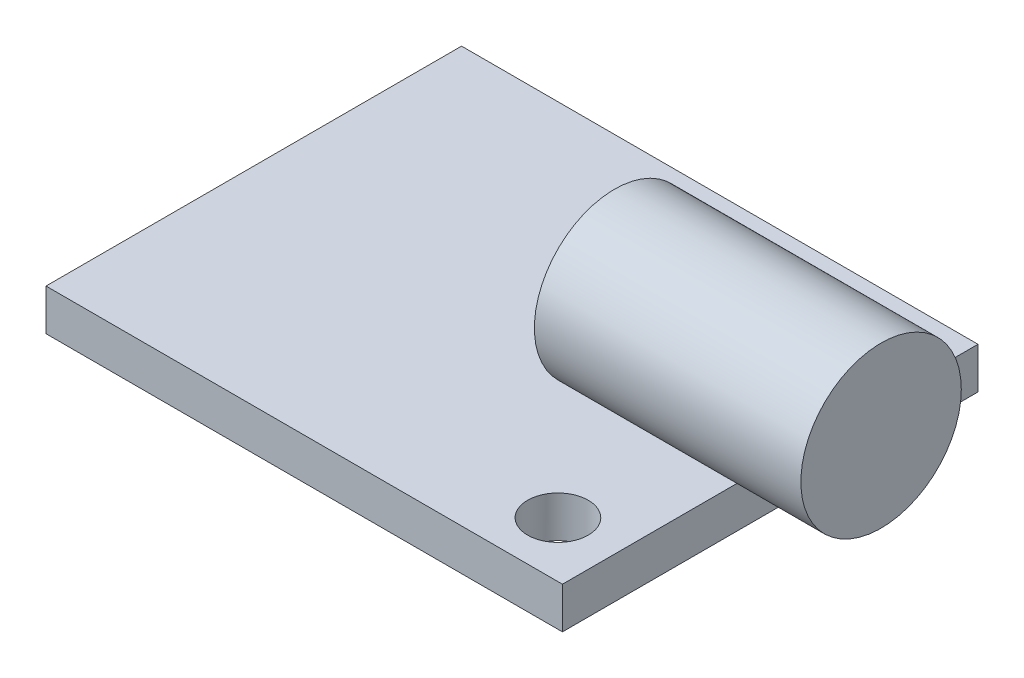
ISO-10303-21;
HEADER;
FILE_DESCRIPTION(('STEP AP214'),'2;1');
FILE_NAME('part.step','',(''),(''),'','','');
FILE_SCHEMA(('AUTOMOTIVE_DESIGN { 1 0 10303 214 1 1 1 1 }'));
ENDSEC;
DATA;
#1=APPLICATION_CONTEXT('core data for automotive mechanical design processes');
#2=APPLICATION_PROTOCOL_DEFINITION('international standard','automotive_design',2000,#1);
#3=PRODUCT_CONTEXT('',#1,'mechanical');
#4=PRODUCT('Part','Part','',(#3));
#5=PRODUCT_RELATED_PRODUCT_CATEGORY('part','',(#4));
#6=PRODUCT_DEFINITION_FORMATION('','',#4);
#7=PRODUCT_DEFINITION_CONTEXT('part definition',#1,'design');
#8=PRODUCT_DEFINITION('design','',#6,#7);
#9=PRODUCT_DEFINITION_SHAPE('','',#8);
#10=(LENGTH_UNIT() NAMED_UNIT(*) SI_UNIT(.MILLI.,.METRE.));
#11=(NAMED_UNIT(*) PLANE_ANGLE_UNIT() SI_UNIT($,.RADIAN.));
#12=(NAMED_UNIT(*) SI_UNIT($,.STERADIAN.) SOLID_ANGLE_UNIT());
#13=UNCERTAINTY_MEASURE_WITH_UNIT(LENGTH_MEASURE(1.E-05),#10,'distance_accuracy_value','');
#14=(GEOMETRIC_REPRESENTATION_CONTEXT(3) GLOBAL_UNCERTAINTY_ASSIGNED_CONTEXT((#13)) GLOBAL_UNIT_ASSIGNED_CONTEXT((#10,
#11,#12)) REPRESENTATION_CONTEXT('',''));
#15=CARTESIAN_POINT('',(0.,0.,0.));
#16=DIRECTION('',(0.,0.,1.));
#17=DIRECTION('',(1.,0.,0.));
#18=AXIS2_PLACEMENT_3D('',#15,#16,#17);
#19=CARTESIAN_POINT('',(13.3096,4.4831,7.66445));
#20=DIRECTION('',(1.,0.,0.));
#21=DIRECTION('',(0.,0.,-1.));
#22=AXIS2_PLACEMENT_3D('',#19,#20,#21);
#23=CYLINDRICAL_SURFACE('',#22,2.9591);
#24=CARTESIAN_POINT('',(13.3096,4.4831,7.66445));
#25=DIRECTION('',(1.,0.,0.));
#26=DIRECTION('',(0.,0.,-1.));
#27=AXIS2_PLACEMENT_3D('',#24,#25,#26);
#28=CIRCLE('',#27,2.9591);
#29=CARTESIAN_POINT('',(13.3096,4.4831,4.70535));
#30=VERTEX_POINT('',#29);
#31=EDGE_CURVE('E11',#30,#30,#28,.T.);
#32=CARTESIAN_POINT('',(23.1394,4.4831,7.66445));
#33=DIRECTION('',(1.,0.,0.));
#34=DIRECTION('',(0.,0.,-1.));
#35=AXIS2_PLACEMENT_3D('',#32,#33,#34);
#36=CIRCLE('',#35,2.9591);
#37=CARTESIAN_POINT('',(23.1394,4.4831,4.70535));
#38=VERTEX_POINT('',#37);
#39=EDGE_CURVE('E47',#38,#38,#36,.T.);
#40=CARTESIAN_POINT('',(13.3096,4.4831,4.70535));
#41=CARTESIAN_POINT('',(13.41199375,4.4831,4.70535));
#42=CARTESIAN_POINT('',(13.5143875,4.4831,4.70535));
#43=CARTESIAN_POINT('',(13.719175,4.4831,4.70535));
#44=CARTESIAN_POINT('',(13.82156875,4.4831,4.70535));
#45=CARTESIAN_POINT('',(14.02635625,4.4831,4.70535));
#46=CARTESIAN_POINT('',(14.12875,4.4831,4.70535));
#47=CARTESIAN_POINT('',(14.3335375,4.4831,4.70535));
#48=CARTESIAN_POINT('',(14.43593125,4.4831,4.70535));
#49=CARTESIAN_POINT('',(14.64071875,4.4831,4.70535));
#50=CARTESIAN_POINT('',(14.7431125,4.4831,4.70535));
#51=CARTESIAN_POINT('',(14.9479,4.4831,4.70535));
#52=CARTESIAN_POINT('',(15.05029375,4.4831,4.70535));
#53=CARTESIAN_POINT('',(15.25508125,4.4831,4.70535));
#54=CARTESIAN_POINT('',(15.357475,4.4831,4.70535));
#55=CARTESIAN_POINT('',(15.5622625,4.4831,4.70535));
#56=CARTESIAN_POINT('',(15.66465625,4.4831,4.70535));
#57=CARTESIAN_POINT('',(15.86944375,4.4831,4.70535));
#58=CARTESIAN_POINT('',(15.9718375,4.4831,4.70535));
#59=CARTESIAN_POINT('',(16.176625,4.4831,4.70535));
#60=CARTESIAN_POINT('',(16.27901875,4.4831,4.70535));
#61=CARTESIAN_POINT('',(16.48380625,4.4831,4.70535));
#62=CARTESIAN_POINT('',(16.5862,4.4831,4.70535));
#63=CARTESIAN_POINT('',(16.7909875,4.4831,4.70535));
#64=CARTESIAN_POINT('',(16.89338125,4.4831,4.70535));
#65=CARTESIAN_POINT('',(17.09816875,4.4831,4.70535));
#66=CARTESIAN_POINT('',(17.2005625,4.4831,4.70535));
#67=CARTESIAN_POINT('',(17.40535,4.4831,4.70535));
#68=CARTESIAN_POINT('',(17.50774375,4.4831,4.70535));
#69=CARTESIAN_POINT('',(17.71253125,4.4831,4.70535));
#70=CARTESIAN_POINT('',(17.814925,4.4831,4.70535));
#71=CARTESIAN_POINT('',(18.0197125,4.4831,4.70535));
#72=CARTESIAN_POINT('',(18.12210625,4.4831,4.70535));
#73=CARTESIAN_POINT('',(18.32689375,4.4831,4.70535));
#74=CARTESIAN_POINT('',(18.4292875,4.4831,4.70535));
#75=CARTESIAN_POINT('',(18.634075,4.4831,4.70535));
#76=CARTESIAN_POINT('',(18.73646875,4.4831,4.70535));
#77=CARTESIAN_POINT('',(18.94125625,4.4831,4.70535));
#78=CARTESIAN_POINT('',(19.04365,4.4831,4.70535));
#79=CARTESIAN_POINT('',(19.2484375,4.4831,4.70535));
#80=CARTESIAN_POINT('',(19.35083125,4.4831,4.70535));
#81=CARTESIAN_POINT('',(19.55561875,4.4831,4.70535));
#82=CARTESIAN_POINT('',(19.6580125,4.4831,4.70535));
#83=CARTESIAN_POINT('',(19.8628,4.4831,4.70535));
#84=CARTESIAN_POINT('',(19.96519375,4.4831,4.70535));
#85=CARTESIAN_POINT('',(20.16998125,4.4831,4.70535));
#86=CARTESIAN_POINT('',(20.272375,4.4831,4.70535));
#87=CARTESIAN_POINT('',(20.4771625,4.4831,4.70535));
#88=CARTESIAN_POINT('',(20.57955625,4.4831,4.70535));
#89=CARTESIAN_POINT('',(20.78434375,4.4831,4.70535));
#90=CARTESIAN_POINT('',(20.8867375,4.4831,4.70535));
#91=CARTESIAN_POINT('',(21.091525,4.4831,4.70535));
#92=CARTESIAN_POINT('',(21.19391875,4.4831,4.70535));
#93=CARTESIAN_POINT('',(21.39870625,4.4831,4.70535));
#94=CARTESIAN_POINT('',(21.5011,4.4831,4.70535));
#95=CARTESIAN_POINT('',(21.7058875,4.4831,4.70535));
#96=CARTESIAN_POINT('',(21.80828125,4.4831,4.70535));
#97=CARTESIAN_POINT('',(22.01306875,4.4831,4.70535));
#98=CARTESIAN_POINT('',(22.1154625,4.4831,4.70535));
#99=CARTESIAN_POINT('',(22.32025,4.4831,4.70535));
#100=CARTESIAN_POINT('',(22.42264375,4.4831,4.70535));
#101=CARTESIAN_POINT('',(22.62743125,4.4831,4.70535));
#102=CARTESIAN_POINT('',(22.729825,4.4831,4.70535));
#103=CARTESIAN_POINT('',(22.9346125,4.4831,4.70535));
#104=CARTESIAN_POINT('',(23.03700625,4.4831,4.70535));
#105=CARTESIAN_POINT('',(23.1394,4.4831,4.70535));
#106=B_SPLINE_CURVE_WITH_KNOTS('',3,(#40,#41,#42,#43,#44,#45,#46,#47,#48,#49,#50,#51,#52,#53,
#54,#55,#56,#57,#58,#59,#60,#61,#62,#63,#64,#65,#66,#67,#68,#69,#70,#71,#72,#73,#74,#75,#76,#77,
#78,#79,#80,#81,#82,#83,#84,#85,#86,#87,#88,#89,#90,#91,#92,#93,#94,#95,#96,#97,#98,#99,#100,
#101,#102,#103,#104,#105),.UNSPECIFIED.,.F.,.F.,(4,2,2,2,2,2,2,2,2,2,2,2,2,2,2,2,2,2,2,2,2,2,2,
2,2,2,2,2,2,2,2,2,4),(0.,0.307181250000002,0.614362500000002,0.921543750000002,1.228725,
1.53590625,1.8430875,2.15026875,2.45745,2.76463125,3.0718125,3.37899375,3.686175,3.99335625,
4.3005375,4.60771875,4.9149,5.22208125,5.5292625,5.83644375,6.143625,6.45080625,6.7579875,
7.06516875,7.37235,7.67953125,7.9867125,8.29389375,8.601075,8.90825625,9.2154375,9.52261875,
9.8298),.UNSPECIFIED.);
#107=EDGE_CURVE('BSEAM41',#30,#38,#106,.T.);
#108=ORIENTED_EDGE('',*,*,#31,.T.);
#109=ORIENTED_EDGE('',*,*,#39,.F.);
#110=ORIENTED_EDGE('',*,*,#107,.T.);
#111=ORIENTED_EDGE('',*,*,#107,.F.);
#112=EDGE_LOOP('',(#108,#110,#109,#111));
#113=FACE_BOUND('',#112,.T.);
#114=ADVANCED_FACE('F41',(#113),#23,.T.);
#115=CARTESIAN_POINT('',(13.3096,4.4831,7.66445));
#116=DIRECTION('',(1.,0.,0.));
#117=DIRECTION('',(0.,0.,-1.));
#118=AXIS2_PLACEMENT_3D('',#115,#116,#117);
#119=PLANE('',#118);
#120=ORIENTED_EDGE('',*,*,#31,.F.);
#121=EDGE_LOOP('',(#120));
#122=FACE_BOUND('',#121,.T.);
#123=ADVANCED_FACE('F56',(#122),#119,.F.);
#124=CARTESIAN_POINT('',(23.1394,4.4831,7.66445));
#125=DIRECTION('',(1.,0.,0.));
#126=DIRECTION('',(0.,0.,-1.));
#127=AXIS2_PLACEMENT_3D('',#124,#125,#126);
#128=PLANE('',#127);
#129=ORIENTED_EDGE('',*,*,#39,.T.);
#130=EDGE_LOOP('',(#129));
#131=FACE_BOUND('',#130,.T.);
#132=ADVANCED_FACE('F53',(#131),#128,.T.);
#133=CLOSED_SHELL('',(#114,#123,#132));
#134=MANIFOLD_SOLID_BREP('B2',#133);
#135=CARTESIAN_POINT('',(0.,1.524,15.3289));
#136=DIRECTION('',(0.,0.,-1.));
#137=DIRECTION('',(-1.,0.,0.));
#138=AXIS2_PLACEMENT_3D('',#135,#136,#137);
#139=PLANE('',#138);
#140=DIRECTION('',(1.,0.,0.));
#141=VECTOR('',#140,1.);
#142=CARTESIAN_POINT('',(0.,0.,15.3289));
#143=LINE('',#142,#141);
#144=CARTESIAN_POINT('',(0.,0.,15.3289));
#145=VERTEX_POINT('',#144);
#146=CARTESIAN_POINT('',(19.05,0.,15.3289));
#147=VERTEX_POINT('',#146);
#148=EDGE_CURVE('E147',#145,#147,#143,.T.);
#149=ORIENTED_EDGE('',*,*,#148,.T.);
#150=DIRECTION('',(0.,-1.,0.));
#151=VECTOR('',#150,1.);
#152=CARTESIAN_POINT('',(19.05,1.524,15.3289));
#153=LINE('',#152,#151);
#154=CARTESIAN_POINT('',(19.05,1.524,15.3289));
#155=VERTEX_POINT('',#154);
#156=EDGE_CURVE('E39',#155,#147,#153,.T.);
#157=ORIENTED_EDGE('',*,*,#156,.F.);
#158=DIRECTION('',(1.,0.,0.));
#159=VECTOR('',#158,1.);
#160=CARTESIAN_POINT('',(0.,1.524,15.3289));
#161=LINE('',#160,#159);
#162=CARTESIAN_POINT('',(0.,1.524,15.3289));
#163=VERTEX_POINT('',#162);
#164=EDGE_CURVE('E123',#163,#155,#161,.T.);
#165=ORIENTED_EDGE('',*,*,#164,.F.);
#166=DIRECTION('',(0.,-1.,0.));
#167=VECTOR('',#166,1.);
#168=CARTESIAN_POINT('',(0.,1.524,15.3289));
#169=LINE('',#168,#167);
#170=EDGE_CURVE('E143',#163,#145,#169,.T.);
#171=ORIENTED_EDGE('',*,*,#170,.T.);
#172=EDGE_LOOP('',(#149,#157,#165,#171));
#173=FACE_BOUND('',#172,.T.);
#174=ADVANCED_FACE('F82',(#173),#139,.F.);
#175=CARTESIAN_POINT('',(19.05,1.524,0.));
#176=DIRECTION('',(1.,0.,0.));
#177=DIRECTION('',(0.,0.,-1.));
#178=AXIS2_PLACEMENT_3D('',#175,#176,#177);
#179=PLANE('',#178);
#180=DIRECTION('',(0.,0.,1.));
#181=VECTOR('',#180,1.);
#182=CARTESIAN_POINT('',(19.05,0.,0.));
#183=LINE('',#182,#181);
#184=CARTESIAN_POINT('',(19.05,0.,0.));
#185=VERTEX_POINT('',#184);
#186=EDGE_CURVE('E132',#185,#147,#183,.T.);
#187=ORIENTED_EDGE('',*,*,#186,.F.);
#188=DIRECTION('',(0.,-1.,0.));
#189=VECTOR('',#188,1.);
#190=CARTESIAN_POINT('',(19.05,1.524,0.));
#191=LINE('',#190,#189);
#192=CARTESIAN_POINT('',(19.05,1.524,0.));
#193=VERTEX_POINT('',#192);
#194=EDGE_CURVE('E91',#193,#185,#191,.T.);
#195=ORIENTED_EDGE('',*,*,#194,.F.);
#196=DIRECTION('',(0.,0.,1.));
#197=VECTOR('',#196,1.);
#198=CARTESIAN_POINT('',(19.05,1.524,0.));
#199=LINE('',#198,#197);
#200=EDGE_CURVE('E130',#193,#155,#199,.T.);
#201=ORIENTED_EDGE('',*,*,#200,.T.);
#202=ORIENTED_EDGE('',*,*,#156,.T.);
#203=EDGE_LOOP('',(#187,#195,#201,#202));
#204=FACE_BOUND('',#203,.T.);
#205=ADVANCED_FACE('F129',(#204),#179,.T.);
#206=CARTESIAN_POINT('',(0.,1.524,0.));
#207=DIRECTION('',(0.,0.,-1.));
#208=DIRECTION('',(-1.,0.,0.));
#209=AXIS2_PLACEMENT_3D('',#206,#207,#208);
#210=PLANE('',#209);
#211=DIRECTION('',(1.,0.,0.));
#212=VECTOR('',#211,1.);
#213=CARTESIAN_POINT('',(0.,0.,0.));
#214=LINE('',#213,#212);
#215=CARTESIAN_POINT('',(0.,0.,0.));
#216=VERTEX_POINT('',#215);
#217=EDGE_CURVE('E151',#216,#185,#214,.T.);
#218=ORIENTED_EDGE('',*,*,#217,.F.);
#219=DIRECTION('',(0.,-1.,0.));
#220=VECTOR('',#219,1.);
#221=CARTESIAN_POINT('',(0.,1.524,0.));
#222=LINE('',#221,#220);
#223=CARTESIAN_POINT('',(0.,1.524,0.));
#224=VERTEX_POINT('',#223);
#225=EDGE_CURVE('E115',#224,#216,#222,.T.);
#226=ORIENTED_EDGE('',*,*,#225,.F.);
#227=DIRECTION('',(1.,0.,0.));
#228=VECTOR('',#227,1.);
#229=CARTESIAN_POINT('',(0.,1.524,0.));
#230=LINE('',#229,#228);
#231=EDGE_CURVE('E139',#224,#193,#230,.T.);
#232=ORIENTED_EDGE('',*,*,#231,.T.);
#233=ORIENTED_EDGE('',*,*,#194,.T.);
#234=EDGE_LOOP('',(#218,#226,#232,#233));
#235=FACE_BOUND('',#234,.T.);
#236=ADVANCED_FACE('F141',(#235),#210,.T.);
#237=CARTESIAN_POINT('',(0.,1.524,0.));
#238=DIRECTION('',(1.,0.,0.));
#239=DIRECTION('',(0.,0.,-1.));
#240=AXIS2_PLACEMENT_3D('',#237,#238,#239);
#241=PLANE('',#240);
#242=DIRECTION('',(0.,0.,1.));
#243=VECTOR('',#242,1.);
#244=CARTESIAN_POINT('',(0.,0.,0.));
#245=LINE('',#244,#243);
#246=EDGE_CURVE('E118',#216,#145,#245,.T.);
#247=ORIENTED_EDGE('',*,*,#246,.T.);
#248=ORIENTED_EDGE('',*,*,#170,.F.);
#249=DIRECTION('',(0.,0.,1.));
#250=VECTOR('',#249,1.);
#251=CARTESIAN_POINT('',(0.,1.524,0.));
#252=LINE('',#251,#250);
#253=EDGE_CURVE('E100',#224,#163,#252,.T.);
#254=ORIENTED_EDGE('',*,*,#253,.F.);
#255=ORIENTED_EDGE('',*,*,#225,.T.);
#256=EDGE_LOOP('',(#247,#248,#254,#255));
#257=FACE_BOUND('',#256,.T.);
#258=ADVANCED_FACE('F174',(#257),#241,.F.);
#259=CARTESIAN_POINT('',(0.,1.524,0.));
#260=DIRECTION('',(0.,-1.,0.));
#261=DIRECTION('',(0.,0.,-1.));
#262=AXIS2_PLACEMENT_3D('',#259,#260,#261);
#263=PLANE('',#262);
#264=CARTESIAN_POINT('',(16.8423535478525,1.524,13.2872406975147));
#265=DIRECTION('',(0.,1.,0.));
#266=DIRECTION('',(0.,0.,1.));
#267=AXIS2_PLACEMENT_3D('',#264,#265,#266);
#268=CIRCLE('',#267,1.1176);
#269=CARTESIAN_POINT('',(16.8423535478525,1.524,14.4048406975147));
#270=VERTEX_POINT('',#269);
#271=EDGE_CURVE('E157',#270,#270,#268,.T.);
#272=ORIENTED_EDGE('',*,*,#271,.F.);
#273=EDGE_LOOP('',(#272));
#274=FACE_BOUND('',#273,.T.);
#275=CARTESIAN_POINT('',(16.8423535478525,1.524,2.78434069751466));
#276=DIRECTION('',(0.,1.,0.));
#277=DIRECTION('',(0.,0.,1.));
#278=AXIS2_PLACEMENT_3D('',#275,#276,#277);
#279=CIRCLE('',#278,1.1176);
#280=CARTESIAN_POINT('',(16.8423535478525,1.524,3.90194069751466));
#281=VERTEX_POINT('',#280);
#282=EDGE_CURVE('E162',#281,#281,#279,.T.);
#283=ORIENTED_EDGE('',*,*,#282,.F.);
#284=EDGE_LOOP('',(#283));
#285=FACE_BOUND('',#284,.T.);
#286=ORIENTED_EDGE('',*,*,#164,.T.);
#287=ORIENTED_EDGE('',*,*,#200,.F.);
#288=ORIENTED_EDGE('',*,*,#231,.F.);
#289=ORIENTED_EDGE('',*,*,#253,.T.);
#290=EDGE_LOOP('',(#286,#287,#288,#289));
#291=FACE_BOUND('',#290,.T.);
#292=ADVANCED_FACE('F138',(#274,#285,#291),#263,.F.);
#293=CARTESIAN_POINT('',(0.,0.,0.));
#294=DIRECTION('',(0.,-1.,0.));
#295=DIRECTION('',(0.,0.,-1.));
#296=AXIS2_PLACEMENT_3D('',#293,#294,#295);
#297=PLANE('',#296);
#298=CARTESIAN_POINT('',(16.8423535478525,0.,13.2872406975147));
#299=DIRECTION('',(0.,-1.,0.));
#300=DIRECTION('',(0.,0.,-1.));
#301=AXIS2_PLACEMENT_3D('',#298,#299,#300);
#302=CIRCLE('',#301,1.1176);
#303=CARTESIAN_POINT('',(16.8423535478525,0.,12.1696406975147));
#304=VERTEX_POINT('',#303);
#305=EDGE_CURVE('E85',#304,#304,#302,.T.);
#306=ORIENTED_EDGE('',*,*,#305,.F.);
#307=EDGE_LOOP('',(#306));
#308=FACE_BOUND('',#307,.T.);
#309=CARTESIAN_POINT('',(16.8423535478525,0.,2.78434069751466));
#310=DIRECTION('',(0.,-1.,0.));
#311=DIRECTION('',(0.,0.,-1.));
#312=AXIS2_PLACEMENT_3D('',#309,#310,#311);
#313=CIRCLE('',#312,1.1176);
#314=CARTESIAN_POINT('',(16.8423535478525,0.,1.66674069751465));
#315=VERTEX_POINT('',#314);
#316=EDGE_CURVE('E155',#315,#315,#313,.T.);
#317=ORIENTED_EDGE('',*,*,#316,.F.);
#318=EDGE_LOOP('',(#317));
#319=FACE_BOUND('',#318,.T.);
#320=ORIENTED_EDGE('',*,*,#148,.F.);
#321=ORIENTED_EDGE('',*,*,#246,.F.);
#322=ORIENTED_EDGE('',*,*,#217,.T.);
#323=ORIENTED_EDGE('',*,*,#186,.T.);
#324=EDGE_LOOP('',(#320,#321,#322,#323));
#325=FACE_BOUND('',#324,.T.);
#326=ADVANCED_FACE('F173',(#308,#319,#325),#297,.T.);
#327=CARTESIAN_POINT('',(16.8423535478525,-2.5654,2.78434069751466));
#328=DIRECTION('',(0.,1.,0.));
#329=DIRECTION('',(0.,0.,1.));
#330=AXIS2_PLACEMENT_3D('',#327,#328,#329);
#331=CYLINDRICAL_SURFACE('',#330,1.1176);
#332=ORIENTED_EDGE('',*,*,#316,.T.);
#333=EDGE_LOOP('',(#332));
#334=FACE_BOUND('',#333,.T.);
#335=ORIENTED_EDGE('',*,*,#282,.T.);
#336=EDGE_LOOP('',(#335));
#337=FACE_BOUND('',#336,.T.);
#338=ADVANCED_FACE('F170',(#334,#337),#331,.F.);
#339=CARTESIAN_POINT('',(16.8423535478525,-2.5654,13.2872406975147));
#340=DIRECTION('',(0.,1.,0.));
#341=DIRECTION('',(0.,0.,1.));
#342=AXIS2_PLACEMENT_3D('',#339,#340,#341);
#343=CYLINDRICAL_SURFACE('',#342,1.1176);
#344=ORIENTED_EDGE('',*,*,#305,.T.);
#345=EDGE_LOOP('',(#344));
#346=FACE_BOUND('',#345,.T.);
#347=ORIENTED_EDGE('',*,*,#271,.T.);
#348=EDGE_LOOP('',(#347));
#349=FACE_BOUND('',#348,.T.);
#350=ADVANCED_FACE('F221',(#346,#349),#343,.F.);
#351=CLOSED_SHELL('',(#174,#205,#236,#258,#292,#326,#338,#350));
#352=MANIFOLD_SOLID_BREP('B6',#351);
#353=ADVANCED_BREP_SHAPE_REPRESENTATION('',(#18,#134,#352),#14);
#354=SHAPE_DEFINITION_REPRESENTATION(#9,#353);
ENDSEC;
END-ISO-10303-21;
